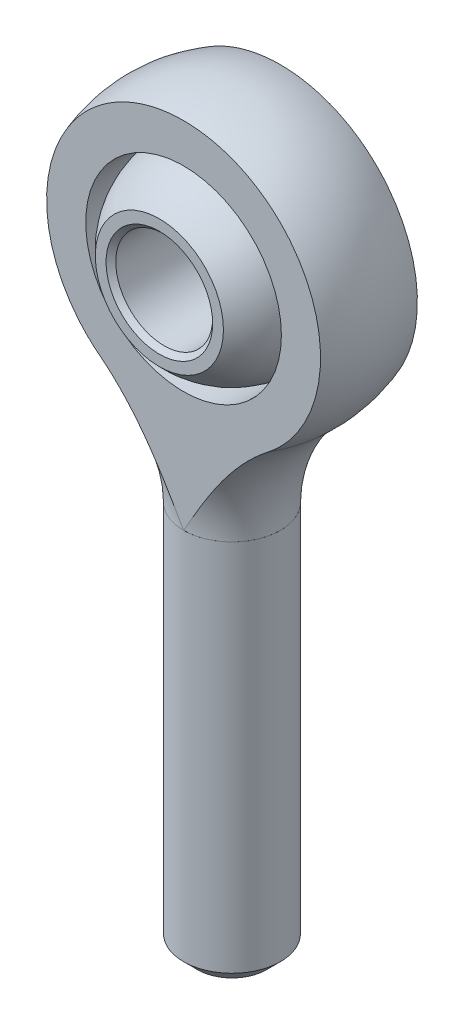
ISO-10303-21;
HEADER;
FILE_DESCRIPTION(('STEP AP214'),'2;1');
FILE_NAME('part.step','',(''),(''),'','','');
FILE_SCHEMA(('AUTOMOTIVE_DESIGN { 1 0 10303 214 1 1 1 1 }'));
ENDSEC;
DATA;
#1=APPLICATION_CONTEXT('core data for automotive mechanical design processes');
#2=APPLICATION_PROTOCOL_DEFINITION('international standard','automotive_design',2000,#1);
#3=PRODUCT_CONTEXT('',#1,'mechanical');
#4=PRODUCT('Part','Part','',(#3));
#5=PRODUCT_RELATED_PRODUCT_CATEGORY('part','',(#4));
#6=PRODUCT_DEFINITION_FORMATION('','',#4);
#7=PRODUCT_DEFINITION_CONTEXT('part definition',#1,'design');
#8=PRODUCT_DEFINITION('design','',#6,#7);
#9=PRODUCT_DEFINITION_SHAPE('','',#8);
#10=(LENGTH_UNIT() NAMED_UNIT(*) SI_UNIT(.MILLI.,.METRE.));
#11=(NAMED_UNIT(*) PLANE_ANGLE_UNIT() SI_UNIT($,.RADIAN.));
#12=(NAMED_UNIT(*) SI_UNIT($,.STERADIAN.) SOLID_ANGLE_UNIT());
#13=UNCERTAINTY_MEASURE_WITH_UNIT(LENGTH_MEASURE(1.E-05),#10,'distance_accuracy_value','');
#14=(GEOMETRIC_REPRESENTATION_CONTEXT(3) GLOBAL_UNCERTAINTY_ASSIGNED_CONTEXT((#13)) GLOBAL_UNIT_ASSIGNED_CONTEXT((#10,
#11,#12)) REPRESENTATION_CONTEXT('',''));
#15=CARTESIAN_POINT('',(0.,0.,0.));
#16=DIRECTION('',(0.,0.,1.));
#17=DIRECTION('',(1.,0.,0.));
#18=AXIS2_PLACEMENT_3D('',#15,#16,#17);
#19=CARTESIAN_POINT('',(0.,14.2875,0.));
#20=DIRECTION('',(0.,-1.,0.));
#21=DIRECTION('',(-1.,0.,0.));
#22=AXIS2_PLACEMENT_3D('',#19,#20,#21);
#23=SPHERICAL_SURFACE('',#22,6.35);
#24=CARTESIAN_POINT('',(0.,14.2875,0.));
#25=DIRECTION('',(0.,0.,1.));
#26=DIRECTION('',(1.,0.,0.));
#27=AXIS2_PLACEMENT_3D('',#24,#25,#26);
#28=SPHERICAL_SURFACE('',#27,6.35);
#29=CARTESIAN_POINT('',(0.,14.2875,-4.7625));
#30=DIRECTION('',(0.,0.,1.));
#31=DIRECTION('',(1.,0.,0.));
#32=AXIS2_PLACEMENT_3D('',#29,#30,#31);
#33=CIRCLE('',#32,4.20013020631503);
#34=CARTESIAN_POINT('',(4.20013020631503,14.2875,-4.7625));
#35=VERTEX_POINT('',#34);
#36=EDGE_CURVE('E72',#35,#35,#33,.F.);
#37=ORIENTED_EDGE('',*,*,#36,.F.);
#38=EDGE_LOOP('',(#37));
#39=FACE_BOUND('',#38,.T.);
#40=CARTESIAN_POINT('',(0.,14.2875,4.7625));
#41=DIRECTION('',(0.,0.,1.));
#42=DIRECTION('',(1.,0.,0.));
#43=AXIS2_PLACEMENT_3D('',#40,#41,#42);
#44=CIRCLE('',#43,4.20013020631504);
#45=CARTESIAN_POINT('',(4.20013020631504,14.2875,4.7625));
#46=VERTEX_POINT('',#45);
#47=EDGE_CURVE('E75',#46,#46,#44,.F.);
#48=ORIENTED_EDGE('',*,*,#47,.T.);
#49=EDGE_LOOP('',(#48));
#50=FACE_BOUND('',#49,.T.);
#51=ADVANCED_FACE('F52',(#39,#50),#28,.T.);
#52=CARTESIAN_POINT('',(0.,14.2875,-6.35));
#53=DIRECTION('',(0.,0.,1.));
#54=DIRECTION('',(1.,0.,0.));
#55=AXIS2_PLACEMENT_3D('',#52,#53,#54);
#56=CYLINDRICAL_SURFACE('',#55,3.175);
#57=CARTESIAN_POINT('',(0.,14.2875,-4.445));
#58=DIRECTION('',(0.,0.,1.));
#59=DIRECTION('',(1.,0.,0.));
#60=AXIS2_PLACEMENT_3D('',#57,#58,#59);
#61=CIRCLE('',#60,3.175);
#62=CARTESIAN_POINT('',(3.175,14.2875,-4.445));
#63=VERTEX_POINT('',#62);
#64=EDGE_CURVE('E63',#63,#63,#61,.F.);
#65=ORIENTED_EDGE('',*,*,#64,.T.);
#66=EDGE_LOOP('',(#65));
#67=FACE_BOUND('',#66,.T.);
#68=CARTESIAN_POINT('',(0.,14.2875,4.445));
#69=DIRECTION('',(0.,0.,1.));
#70=DIRECTION('',(1.,0.,0.));
#71=AXIS2_PLACEMENT_3D('',#68,#69,#70);
#72=CIRCLE('',#71,3.175);
#73=CARTESIAN_POINT('',(3.175,14.2875,4.445));
#74=VERTEX_POINT('',#73);
#75=EDGE_CURVE('E67',#74,#74,#72,.T.);
#76=ORIENTED_EDGE('',*,*,#75,.T.);
#77=EDGE_LOOP('',(#76));
#78=FACE_BOUND('',#77,.T.);
#79=ADVANCED_FACE('F90',(#67,#78),#56,.F.);
#80=CARTESIAN_POINT('',(0.,0.,-4.7625));
#81=DIRECTION('',(0.,0.,1.));
#82=DIRECTION('',(1.,0.,0.));
#83=AXIS2_PLACEMENT_3D('',#80,#81,#82);
#84=PLANE('',#83);
#85=CARTESIAN_POINT('',(0.,14.2875,-4.7625));
#86=DIRECTION('',(0.,0.,1.));
#87=DIRECTION('',(1.,0.,0.));
#88=AXIS2_PLACEMENT_3D('',#85,#86,#87);
#89=CIRCLE('',#88,3.4925);
#90=CARTESIAN_POINT('',(3.49250000000001,14.2875,-4.7625));
#91=VERTEX_POINT('',#90);
#92=EDGE_CURVE('E59',#91,#91,#89,.T.);
#93=ORIENTED_EDGE('',*,*,#92,.T.);
#94=EDGE_LOOP('',(#93));
#95=FACE_BOUND('',#94,.T.);
#96=ORIENTED_EDGE('',*,*,#36,.T.);
#97=EDGE_LOOP('',(#96));
#98=FACE_BOUND('',#97,.T.);
#99=ADVANCED_FACE('F83',(#95,#98),#84,.F.);
#100=CARTESIAN_POINT('',(0.,0.,4.7625));
#101=DIRECTION('',(0.,0.,1.));
#102=DIRECTION('',(1.,0.,0.));
#103=AXIS2_PLACEMENT_3D('',#100,#101,#102);
#104=PLANE('',#103);
#105=CARTESIAN_POINT('',(0.,14.2875,4.7625));
#106=DIRECTION('',(0.,0.,1.));
#107=DIRECTION('',(1.,0.,0.));
#108=AXIS2_PLACEMENT_3D('',#105,#106,#107);
#109=CIRCLE('',#108,3.4925);
#110=CARTESIAN_POINT('',(3.4925,14.2875,4.7625));
#111=VERTEX_POINT('',#110);
#112=EDGE_CURVE('E11',#111,#111,#109,.F.);
#113=ORIENTED_EDGE('',*,*,#112,.T.);
#114=EDGE_LOOP('',(#113));
#115=FACE_BOUND('',#114,.T.);
#116=ORIENTED_EDGE('',*,*,#47,.F.);
#117=EDGE_LOOP('',(#116));
#118=FACE_BOUND('',#117,.T.);
#119=ADVANCED_FACE('F80',(#115,#118),#104,.T.);
#120=CARTESIAN_POINT('',(0.,14.2875,-4.445));
#121=DIRECTION('',(0.,0.,-1.));
#122=DIRECTION('',(-1.,0.,0.));
#123=AXIS2_PLACEMENT_3D('',#120,#121,#122);
#124=CONICAL_SURFACE('',#123,3.175,0.785398163397453);
#125=ORIENTED_EDGE('',*,*,#92,.F.);
#126=EDGE_LOOP('',(#125));
#127=FACE_BOUND('',#126,.T.);
#128=ORIENTED_EDGE('',*,*,#64,.F.);
#129=EDGE_LOOP('',(#128));
#130=FACE_BOUND('',#129,.T.);
#131=ADVANCED_FACE('F82',(#127,#130),#124,.F.);
#132=CARTESIAN_POINT('',(0.,14.2875,4.7625));
#133=DIRECTION('',(0.,0.,1.));
#134=DIRECTION('',(1.,0.,0.));
#135=AXIS2_PLACEMENT_3D('',#132,#133,#134);
#136=CONICAL_SURFACE('',#135,3.4925,0.785398163397446);
#137=ORIENTED_EDGE('',*,*,#75,.F.);
#138=EDGE_LOOP('',(#137));
#139=FACE_BOUND('',#138,.T.);
#140=ORIENTED_EDGE('',*,*,#112,.F.);
#141=EDGE_LOOP('',(#140));
#142=FACE_BOUND('',#141,.T.);
#143=ADVANCED_FACE('F54',(#139,#142),#136,.F.);
#144=CLOSED_SHELL('',(#51,#79,#99,#119,#131,#143));
#145=MANIFOLD_SOLID_BREP('B2',#144);
#146=CARTESIAN_POINT('',(0.,0.,0.));
#147=DIRECTION('',(0.,1.,0.));
#148=DIRECTION('',(-1.,0.,0.));
#149=AXIS2_PLACEMENT_3D('',#146,#147,#148);
#150=TOROIDAL_SURFACE('',#149,12.8984375,9.72343749999999);
#151=CARTESIAN_POINT('',(0.,0.,0.));
#152=DIRECTION('',(0.,1.,0.));
#153=DIRECTION('',(-1.,0.,0.));
#154=AXIS2_PLACEMENT_3D('',#151,#152,#153);
#155=CIRCLE('',#154,3.175);
#156=CARTESIAN_POINT('',(0.,0.,3.175));
#157=VERTEX_POINT('',#156);
#158=CARTESIAN_POINT('',(0.,0.,-3.175));
#159=VERTEX_POINT('',#158);
#160=EDGE_CURVE('E195',#157,#159,#155,.T.);
#161=ORIENTED_EDGE('',*,*,#160,.T.);
#162=CARTESIAN_POINT('',(0.,0.,-3.17500000000001));
#163=CARTESIAN_POINT('',(0.00326153280940056,0.00570768458317873,-3.17500000000001));
#164=CARTESIAN_POINT('',(0.00652306727261801,0.0114153698479134,-3.17500000000002));
#165=CARTESIAN_POINT('',(0.273129494115397,0.477974240381225,-3.17500000000035));
#166=CARTESIAN_POINT('',(0.536560192569003,0.938786382511719,-3.17500000000011));
#167=CARTESIAN_POINT('',(1.075662654448,1.853227853926,-3.17499999999993));
#168=CARTESIAN_POINT('',(1.3513322312136,2.30685844681078,-3.17499999999999));
#169=CARTESIAN_POINT('',(1.92559609433375,3.19894900715909,-3.17500000000004));
#170=CARTESIAN_POINT('',(2.22416629490616,3.63742422867979,-3.17500000000002));
#171=CARTESIAN_POINT('',(2.8530989562683,4.49102276264757,-3.17500000000001));
#172=CARTESIAN_POINT('',(3.18344395160262,4.90615870724843,-3.17500000000001));
#173=CARTESIAN_POINT('',(3.77466960906392,5.58162755340587,-3.17500000000001));
#174=CARTESIAN_POINT('',(4.02585009152447,5.85044049904912,-3.17500000000001));
#175=CARTESIAN_POINT('',(4.54711374408077,6.36901465417316,-3.17500000000001));
#176=CARTESIAN_POINT('',(4.81719088353926,6.61878188916022,-3.17500000000001));
#177=CARTESIAN_POINT('',(5.37662445732568,7.09612768080745,-3.17500000000001));
#178=CARTESIAN_POINT('',(5.6659914754178,7.32369388494061,-3.17500000000001));
#179=CARTESIAN_POINT('',(6.26322715756046,7.75319037760835,-3.17500000000001));
#180=CARTESIAN_POINT('',(6.57109562035419,7.9551209449304,-3.17500000000001));
#181=CARTESIAN_POINT('',(7.20718830531996,8.33213779574809,-3.17500000000001));
#182=CARTESIAN_POINT('',(7.53558873718559,8.50692791162835,-3.17500000000001));
#183=CARTESIAN_POINT('',(8.20771747669195,8.8241919305884,-3.17500000000001));
#184=CARTESIAN_POINT('',(8.55144656909241,8.96666417685807,-3.17500000000001));
#185=CARTESIAN_POINT('',(9.25110720223131,9.21656726401361,-3.17500000000001));
#186=CARTESIAN_POINT('',(9.60702765351498,9.3240290621725,-3.17500000000001));
#187=CARTESIAN_POINT('',(10.3280020281684,9.50191139488449,-3.17500000000001));
#188=CARTESIAN_POINT('',(10.6930544047761,9.57233815850804,-3.17500000000001));
#189=CARTESIAN_POINT('',(11.3741481177677,9.66696888095735,-3.17500000000001));
#190=CARTESIAN_POINT('',(11.6894621095488,9.69646466998759,-3.17500000000001));
#191=CARTESIAN_POINT('',(12.3214131945657,9.72667494727211,-3.17500000000001));
#192=CARTESIAN_POINT('',(12.6380499892607,9.72739561225393,-3.17500000000001));
#193=CARTESIAN_POINT('',(13.2714560117358,9.69958458823502,-3.17500000000001));
#194=CARTESIAN_POINT('',(13.5882199938743,9.67092754785076,-3.17500000000001));
#195=CARTESIAN_POINT('',(14.060301630899,9.60580647493072,-3.17500000000001));
#196=CARTESIAN_POINT('',(14.2172131664817,9.58039570302806,-3.17500000000001));
#197=CARTESIAN_POINT('',(14.5296709917857,9.52221005311295,-3.17500000000001));
#198=CARTESIAN_POINT('',(14.6852172274529,9.48943488488747,-3.17500000000001));
#199=CARTESIAN_POINT('',(14.8399244089083,9.45298870973282,-3.17500000000001));
#200=B_SPLINE_CURVE_WITH_KNOTS('',3,(#162,#163,#164,#165,#166,#167,#168,#169,#170,#171,#172,
#173,#174,#175,#176,#177,#178,#179,#180,#181,#182,#183,#184,#185,#186,#187,#188,#189,#190,#191,
#192,#193,#194,#195,#196,#197,#198,#199),.UNSPECIFIED.,.F.,.F.,(4,2,2,2,2,2,2,2,2,2,2,2,2,2,2,2,
2,2,4),(0.,0.0197214984217776,1.61208077496982,3.20415668854832,4.79458050738229,
6.3841350697976,7.48699761772031,8.58950979194405,9.69263194038169,10.795742091342,
11.9101519426778,13.0246189125206,14.1380977461436,15.2513892393634,16.2001992986571,
17.1488056899235,18.1014765941876,18.5781908797629,19.0549239547892),.UNSPECIFIED.);
#201=CARTESIAN_POINT('',(5.53702467554139,7.21739690722648,-3.17500000000001));
#202=VERTEX_POINT('',#201);
#203=EDGE_CURVE('E50',#159,#202,#200,.T.);
#204=ORIENTED_EDGE('',*,*,#203,.T.);
#205=CARTESIAN_POINT('',(0.,7.21739690721649,0.));
#206=DIRECTION('',(0.,1.,0.));
#207=DIRECTION('',(-1.,0.,0.));
#208=AXIS2_PLACEMENT_3D('',#205,#206,#207);
#209=CIRCLE('',#208,6.38273195876288);
#210=CARTESIAN_POINT('',(5.53702467554139,7.21739690722648,3.17500000000001));
#211=VERTEX_POINT('',#210);
#212=EDGE_CURVE('E201',#211,#202,#209,.T.);
#213=ORIENTED_EDGE('',*,*,#212,.F.);
#214=CARTESIAN_POINT('',(0.,0.,3.175));
#215=CARTESIAN_POINT('',(0.00326153280968916,0.00570768458301649,3.17500000000001));
#216=CARTESIAN_POINT('',(0.00652306727318909,0.0114153698475898,3.17500000000001));
#217=CARTESIAN_POINT('',(0.273129494139749,0.477974240370057,3.17500000000025));
#218=CARTESIAN_POINT('',(0.536560192577593,0.938786382512307,3.17500000000008));
#219=CARTESIAN_POINT('',(1.07566265444661,1.85322785393754,3.17499999999995));
#220=CARTESIAN_POINT('',(1.35133223121798,2.30685844682153,3.17499999999999));
#221=CARTESIAN_POINT('',(1.92559609434366,3.19894900717051,3.17500000000003));
#222=CARTESIAN_POINT('',(2.22416629491579,3.63742422869272,3.17500000000001));
#223=CARTESIAN_POINT('',(2.85309895627944,4.49102276266281,3.17500000000001));
#224=CARTESIAN_POINT('',(3.18344395161558,4.90615870726445,3.17500000000001));
#225=CARTESIAN_POINT('',(3.77466960907839,5.58162755342156,3.17500000000001));
#226=CARTESIAN_POINT('',(4.02585009153859,5.85044049906379,3.17500000000001));
#227=CARTESIAN_POINT('',(4.54711374409417,6.36901465418585,3.17500000000001));
#228=CARTESIAN_POINT('',(4.8171908835523,6.61878188917193,3.17500000000001));
#229=CARTESIAN_POINT('',(5.37662445733852,7.09612768081782,3.17500000000001));
#230=CARTESIAN_POINT('',(5.66599147543084,7.32369388495056,3.17500000000001));
#231=CARTESIAN_POINT('',(6.26322715757394,7.75319037761747,3.17500000000001));
#232=CARTESIAN_POINT('',(6.57109562036791,7.9551209449391,3.17500000000001));
#233=CARTESIAN_POINT('',(7.20718830533395,8.33213779575581,3.17500000000001));
#234=CARTESIAN_POINT('',(7.5355887371996,8.50692791163551,3.17500000000001));
#235=CARTESIAN_POINT('',(8.20771747670592,8.82419193059444,3.17500000000001));
#236=CARTESIAN_POINT('',(8.55144656910631,8.96666417686355,3.17500000000001));
#237=CARTESIAN_POINT('',(9.25110720224452,9.21656726401781,3.17500000000001));
#238=CARTESIAN_POINT('',(9.60702765352753,9.32402906217603,3.17500000000001));
#239=CARTESIAN_POINT('',(10.3280020281796,9.50191139488682,3.17500000000001));
#240=CARTESIAN_POINT('',(10.6930544047865,9.57233815850984,3.17500000000001));
#241=CARTESIAN_POINT('',(11.3741481177771,9.66696888095835,3.17500000000001));
#242=CARTESIAN_POINT('',(11.6894621095577,9.69646466998828,3.17500000000001));
#243=CARTESIAN_POINT('',(12.3214131945738,9.72667494727223,3.17500000000001));
#244=CARTESIAN_POINT('',(12.6380499892684,9.72739561225382,3.17500000000001));
#245=CARTESIAN_POINT('',(13.2714560117432,9.69958458823448,3.17500000000001));
#246=CARTESIAN_POINT('',(13.5882199938819,9.67092754784996,3.17500000000001));
#247=CARTESIAN_POINT('',(14.0603016309067,9.60580647492954,3.17500000000001));
#248=CARTESIAN_POINT('',(14.2172131664894,9.58039570302674,3.17500000000001));
#249=CARTESIAN_POINT('',(14.5296709917936,9.52221005311135,3.17500000000001));
#250=CARTESIAN_POINT('',(14.6852172274608,9.48943488488574,3.17500000000001));
#251=CARTESIAN_POINT('',(14.8399244089163,9.45298870973094,3.17500000000001));
#252=B_SPLINE_CURVE_WITH_KNOTS('',3,(#214,#215,#216,#217,#218,#219,#220,#221,#222,#223,#224,
#225,#226,#227,#228,#229,#230,#231,#232,#233,#234,#235,#236,#237,#238,#239,#240,#241,#242,#243,
#244,#245,#246,#247,#248,#249,#250,#251),.UNSPECIFIED.,.F.,.F.,(4,2,2,2,2,2,2,2,2,2,2,2,2,2,2,2,
2,2,4),(0.,0.0197214984217776,1.61208077497697,3.20415668856199,4.79458050739954,
6.38413506981987,7.48699761773967,8.58950979196063,9.69263194039796,10.7957420913582,
11.9101519426933,13.0246189125353,14.1380977461558,15.2513892393732,16.2001992986656,
17.1488056899307,18.1014765941953,18.5781908797708,19.0549239547973),.UNSPECIFIED.);
#253=EDGE_CURVE('E187',#211,#157,#252,.F.);
#254=ORIENTED_EDGE('',*,*,#253,.T.);
#255=EDGE_LOOP('',(#161,#204,#213,#254));
#256=FACE_BOUND('',#255,.T.);
#257=ADVANCED_FACE('F151',(#256),#150,.F.);
#258=CARTESIAN_POINT('',(0.,14.2875,0.));
#259=DIRECTION('',(0.,1.,0.));
#260=DIRECTION('',(1.,0.,0.));
#261=AXIS2_PLACEMENT_3D('',#258,#259,#260);
#262=SPHERICAL_SURFACE('',#261,9.525);
#263=ORIENTED_EDGE('',*,*,#212,.T.);
#264=CARTESIAN_POINT('',(0.,14.2875,-3.175));
#265=DIRECTION('',(0.,0.,1.));
#266=DIRECTION('',(0.,-1.,0.));
#267=AXIS2_PLACEMENT_3D('',#264,#265,#266);
#268=CIRCLE('',#267,8.98025612106915);
#269=CARTESIAN_POINT('',(-5.53702467554139,7.21739690722647,-3.17500000000001));
#270=VERTEX_POINT('',#269);
#271=EDGE_CURVE('E204',#202,#270,#268,.T.);
#272=ORIENTED_EDGE('',*,*,#271,.T.);
#273=CARTESIAN_POINT('',(-5.53702467554139,7.21739690722648,3.17500000000001));
#274=VERTEX_POINT('',#273);
#275=EDGE_CURVE('E203',#270,#274,#209,.T.);
#276=ORIENTED_EDGE('',*,*,#275,.T.);
#277=CARTESIAN_POINT('',(0.,14.2875,3.175));
#278=DIRECTION('',(0.,0.,-1.));
#279=DIRECTION('',(0.,1.,0.));
#280=AXIS2_PLACEMENT_3D('',#277,#278,#279);
#281=CIRCLE('',#280,8.98025612106915);
#282=EDGE_CURVE('E190',#274,#211,#281,.T.);
#283=ORIENTED_EDGE('',*,*,#282,.T.);
#284=EDGE_LOOP('',(#263,#272,#276,#283));
#285=FACE_BOUND('',#284,.T.);
#286=ADVANCED_FACE('F153',(#285),#262,.T.);
#287=CARTESIAN_POINT('',(3.175,0.,0.));
#288=DIRECTION('',(0.,1.,0.));
#289=DIRECTION('',(-1.,0.,0.));
#290=AXIS2_PLACEMENT_3D('',#287,#288,#289);
#291=PLANE('',#290);
#292=ORIENTED_EDGE('',*,*,#160,.F.);
#293=EDGE_CURVE('E207',#159,#157,#155,.T.);
#294=ORIENTED_EDGE('',*,*,#293,.F.);
#295=EDGE_LOOP('',(#292,#294));
#296=FACE_BOUND('',#295,.T.);
#297=ADVANCED_FACE('F225',(#296),#291,.F.);
#298=ORIENTED_EDGE('',*,*,#275,.F.);
#299=CARTESIAN_POINT('',(0.,0.,-3.17500000000001));
#300=CARTESIAN_POINT('',(-0.00326153280940057,0.00570768458317873,-3.17500000000001));
#301=CARTESIAN_POINT('',(-0.00652306727261801,0.0114153698479134,-3.17500000000002));
#302=CARTESIAN_POINT('',(-0.273129494115397,0.477974240381225,-3.17500000000035));
#303=CARTESIAN_POINT('',(-0.536560192569003,0.938786382511719,-3.17500000000011));
#304=CARTESIAN_POINT('',(-1.075662654448,1.853227853926,-3.17499999999993));
#305=CARTESIAN_POINT('',(-1.3513322312136,2.30685844681079,-3.17499999999999));
#306=CARTESIAN_POINT('',(-1.92559609433375,3.19894900715908,-3.17500000000004));
#307=CARTESIAN_POINT('',(-2.22416629490617,3.63742422867979,-3.17500000000002));
#308=CARTESIAN_POINT('',(-2.8530989562683,4.49102276264757,-3.17500000000001));
#309=CARTESIAN_POINT('',(-3.18344395160262,4.90615870724843,-3.17500000000001));
#310=CARTESIAN_POINT('',(-3.77466960906392,5.58162755340587,-3.17500000000001));
#311=CARTESIAN_POINT('',(-4.02585009152447,5.85044049904911,-3.17500000000001));
#312=CARTESIAN_POINT('',(-4.54711374408077,6.36901465417315,-3.17500000000001));
#313=CARTESIAN_POINT('',(-4.81719088353926,6.61878188916021,-3.17500000000001));
#314=CARTESIAN_POINT('',(-5.37662445732568,7.09612768080745,-3.17500000000001));
#315=CARTESIAN_POINT('',(-5.6659914754178,7.32369388494061,-3.17500000000001));
#316=CARTESIAN_POINT('',(-6.26322715756046,7.75319037760835,-3.17500000000001));
#317=CARTESIAN_POINT('',(-6.57109562035419,7.95512094493039,-3.17500000000001));
#318=CARTESIAN_POINT('',(-7.20718830531996,8.33213779574809,-3.17500000000001));
#319=CARTESIAN_POINT('',(-7.53558873718559,8.50692791162834,-3.17500000000001));
#320=CARTESIAN_POINT('',(-8.20771747669196,8.8241919305884,-3.17500000000001));
#321=CARTESIAN_POINT('',(-8.55144656909241,8.96666417685806,-3.17500000000001));
#322=CARTESIAN_POINT('',(-9.25110720223131,9.21656726401361,-3.17500000000001));
#323=CARTESIAN_POINT('',(-9.60702765351498,9.3240290621725,-3.17500000000001));
#324=CARTESIAN_POINT('',(-10.3280020281684,9.50191139488449,-3.17500000000001));
#325=CARTESIAN_POINT('',(-10.6930544047761,9.57233815850804,-3.17500000000001));
#326=CARTESIAN_POINT('',(-11.3741481177677,9.66696888095735,-3.17500000000001));
#327=CARTESIAN_POINT('',(-11.6894621095487,9.69646466998758,-3.17500000000001));
#328=CARTESIAN_POINT('',(-12.3214131945657,9.7266749472721,-3.17500000000001));
#329=CARTESIAN_POINT('',(-12.6380499892607,9.72739561225393,-3.17500000000001));
#330=CARTESIAN_POINT('',(-13.2714560117358,9.69958458823502,-3.17500000000001));
#331=CARTESIAN_POINT('',(-13.5882199938743,9.67092754785076,-3.17500000000001));
#332=CARTESIAN_POINT('',(-14.060301630899,9.60580647493072,-3.17500000000001));
#333=CARTESIAN_POINT('',(-14.2172131664816,9.58039570302806,-3.17500000000001));
#334=CARTESIAN_POINT('',(-14.5296709917857,9.52221005311295,-3.17500000000001));
#335=CARTESIAN_POINT('',(-14.6852172274529,9.48943488488747,-3.17500000000001));
#336=CARTESIAN_POINT('',(-14.8399244089083,9.45298870973282,-3.17500000000001));
#337=B_SPLINE_CURVE_WITH_KNOTS('',3,(#299,#300,#301,#302,#303,#304,#305,#306,#307,#308,#309,
#310,#311,#312,#313,#314,#315,#316,#317,#318,#319,#320,#321,#322,#323,#324,#325,#326,#327,#328,
#329,#330,#331,#332,#333,#334,#335,#336),.UNSPECIFIED.,.F.,.F.,(4,2,2,2,2,2,2,2,2,2,2,2,2,2,2,2,
2,2,4),(0.,0.0197214984217776,1.61208077496982,3.20415668854832,4.79458050738229,
6.3841350697976,7.48699761772031,8.58950979194404,9.69263194038169,10.795742091342,
11.9101519426778,13.0246189125206,14.1380977461436,15.2513892393634,16.2001992986571,
17.1488056899235,18.1014765941876,18.5781908797629,19.0549239547892),.UNSPECIFIED.);
#338=EDGE_CURVE('E165',#270,#159,#337,.F.);
#339=ORIENTED_EDGE('',*,*,#338,.T.);
#340=ORIENTED_EDGE('',*,*,#293,.T.);
#341=CARTESIAN_POINT('',(0.,0.,3.175));
#342=CARTESIAN_POINT('',(-0.00326153280968916,0.00570768458301648,3.17500000000001));
#343=CARTESIAN_POINT('',(-0.00652306727318909,0.0114153698475898,3.17500000000001));
#344=CARTESIAN_POINT('',(-0.273129494139749,0.477974240370057,3.17500000000025));
#345=CARTESIAN_POINT('',(-0.536560192577592,0.938786382512307,3.17500000000008));
#346=CARTESIAN_POINT('',(-1.0756626544466,1.85322785393754,3.17499999999995));
#347=CARTESIAN_POINT('',(-1.35133223121798,2.30685844682153,3.17499999999999));
#348=CARTESIAN_POINT('',(-1.92559609434366,3.19894900717051,3.17500000000003));
#349=CARTESIAN_POINT('',(-2.22416629491579,3.63742422869272,3.17500000000001));
#350=CARTESIAN_POINT('',(-2.85309895627944,4.4910227626628,3.17500000000001));
#351=CARTESIAN_POINT('',(-3.18344395161558,4.90615870726445,3.17500000000001));
#352=CARTESIAN_POINT('',(-3.77466960907839,5.58162755342156,3.17500000000001));
#353=CARTESIAN_POINT('',(-4.02585009153859,5.85044049906379,3.17500000000001));
#354=CARTESIAN_POINT('',(-4.54711374409417,6.36901465418584,3.17500000000001));
#355=CARTESIAN_POINT('',(-4.8171908835523,6.61878188917193,3.17500000000001));
#356=CARTESIAN_POINT('',(-5.37662445733852,7.09612768081782,3.17500000000001));
#357=CARTESIAN_POINT('',(-5.66599147543084,7.32369388495055,3.17500000000001));
#358=CARTESIAN_POINT('',(-6.26322715757394,7.75319037761747,3.17500000000001));
#359=CARTESIAN_POINT('',(-6.57109562036791,7.95512094493909,3.17500000000001));
#360=CARTESIAN_POINT('',(-7.20718830533395,8.33213779575581,3.17500000000001));
#361=CARTESIAN_POINT('',(-7.5355887371996,8.5069279116355,3.17500000000001));
#362=CARTESIAN_POINT('',(-8.20771747670592,8.82419193059444,3.17500000000001));
#363=CARTESIAN_POINT('',(-8.55144656910631,8.96666417686355,3.17500000000001));
#364=CARTESIAN_POINT('',(-9.25110720224452,9.2165672640178,3.17500000000001));
#365=CARTESIAN_POINT('',(-9.60702765352753,9.32402906217603,3.17500000000001));
#366=CARTESIAN_POINT('',(-10.3280020281796,9.50191139488681,3.17500000000001));
#367=CARTESIAN_POINT('',(-10.6930544047865,9.57233815850983,3.17500000000001));
#368=CARTESIAN_POINT('',(-11.3741481177771,9.66696888095834,3.17500000000001));
#369=CARTESIAN_POINT('',(-11.6894621095577,9.69646466998827,3.17500000000001));
#370=CARTESIAN_POINT('',(-12.3214131945738,9.72667494727223,3.17500000000001));
#371=CARTESIAN_POINT('',(-12.6380499892684,9.72739561225382,3.17500000000001));
#372=CARTESIAN_POINT('',(-13.2714560117432,9.69958458823447,3.17500000000001));
#373=CARTESIAN_POINT('',(-13.5882199938819,9.67092754784996,3.17500000000001));
#374=CARTESIAN_POINT('',(-14.0603016309067,9.60580647492953,3.17500000000001));
#375=CARTESIAN_POINT('',(-14.2172131664894,9.58039570302674,3.17500000000001));
#376=CARTESIAN_POINT('',(-14.5296709917936,9.52221005311135,3.17500000000001));
#377=CARTESIAN_POINT('',(-14.6852172274608,9.48943488488574,3.17500000000001));
#378=CARTESIAN_POINT('',(-14.8399244089163,9.45298870973094,3.17500000000001));
#379=B_SPLINE_CURVE_WITH_KNOTS('',3,(#341,#342,#343,#344,#345,#346,#347,#348,#349,#350,#351,
#352,#353,#354,#355,#356,#357,#358,#359,#360,#361,#362,#363,#364,#365,#366,#367,#368,#369,#370,
#371,#372,#373,#374,#375,#376,#377,#378),.UNSPECIFIED.,.F.,.F.,(4,2,2,2,2,2,2,2,2,2,2,2,2,2,2,2,
2,2,4),(0.,0.0197214984217776,1.61208077497697,3.20415668856199,4.79458050739953,
6.38413506981987,7.48699761773967,8.58950979196062,9.69263194039796,10.7957420913582,
11.9101519426932,13.0246189125353,14.1380977461558,15.2513892393732,16.2001992986656,
17.1488056899307,18.1014765941953,18.5781908797708,19.0549239547973),.UNSPECIFIED.);
#380=EDGE_CURVE('E178',#157,#274,#379,.T.);
#381=ORIENTED_EDGE('',*,*,#380,.T.);
#382=EDGE_LOOP('',(#298,#339,#340,#381));
#383=FACE_BOUND('',#382,.T.);
#384=ADVANCED_FACE('F222',(#383),#150,.F.);
#385=CARTESIAN_POINT('',(-9.525,14.2875,3.175));
#386=DIRECTION('',(0.,0.,-1.));
#387=DIRECTION('',(0.,1.,0.));
#388=AXIS2_PLACEMENT_3D('',#385,#386,#387);
#389=PLANE('',#388);
#390=CARTESIAN_POINT('',(0.,14.2875,3.175));
#391=DIRECTION('',(0.,0.,1.));
#392=DIRECTION('',(1.,0.,0.));
#393=AXIS2_PLACEMENT_3D('',#390,#391,#392);
#394=CIRCLE('',#393,6.4135);
#395=CARTESIAN_POINT('',(6.4135,14.2875,3.175));
#396=VERTEX_POINT('',#395);
#397=EDGE_CURVE('E309',#396,#396,#394,.T.);
#398=ORIENTED_EDGE('',*,*,#397,.F.);
#399=EDGE_LOOP('',(#398));
#400=FACE_BOUND('',#399,.T.);
#401=ORIENTED_EDGE('',*,*,#380,.F.);
#402=ORIENTED_EDGE('',*,*,#253,.F.);
#403=ORIENTED_EDGE('',*,*,#282,.F.);
#404=EDGE_LOOP('',(#401,#402,#403));
#405=FACE_BOUND('',#404,.T.);
#406=ADVANCED_FACE('F189',(#400,#405),#389,.F.);
#407=CARTESIAN_POINT('',(-9.525,14.2875,-3.175));
#408=DIRECTION('',(0.,0.,1.));
#409=DIRECTION('',(0.,-1.,0.));
#410=AXIS2_PLACEMENT_3D('',#407,#408,#409);
#411=PLANE('',#410);
#412=CARTESIAN_POINT('',(0.,14.2875,-3.175));
#413=DIRECTION('',(0.,0.,1.));
#414=DIRECTION('',(1.,0.,0.));
#415=AXIS2_PLACEMENT_3D('',#412,#413,#414);
#416=CIRCLE('',#415,6.4135);
#417=CARTESIAN_POINT('',(6.4135,14.2875,-3.175));
#418=VERTEX_POINT('',#417);
#419=EDGE_CURVE('E205',#418,#418,#416,.T.);
#420=ORIENTED_EDGE('',*,*,#419,.T.);
#421=EDGE_LOOP('',(#420));
#422=FACE_BOUND('',#421,.T.);
#423=ORIENTED_EDGE('',*,*,#203,.F.);
#424=ORIENTED_EDGE('',*,*,#338,.F.);
#425=ORIENTED_EDGE('',*,*,#271,.F.);
#426=EDGE_LOOP('',(#423,#424,#425));
#427=FACE_BOUND('',#426,.T.);
#428=ADVANCED_FACE('F234',(#422,#427),#411,.F.);
#429=CARTESIAN_POINT('',(0.,14.2875,-3.175));
#430=DIRECTION('',(0.,0.,1.));
#431=DIRECTION('',(1.,0.,0.));
#432=AXIS2_PLACEMENT_3D('',#429,#430,#431);
#433=CYLINDRICAL_SURFACE('',#432,6.4135);
#434=ORIENTED_EDGE('',*,*,#419,.F.);
#435=EDGE_LOOP('',(#434));
#436=FACE_BOUND('',#435,.T.);
#437=ORIENTED_EDGE('',*,*,#397,.T.);
#438=EDGE_LOOP('',(#437));
#439=FACE_BOUND('',#438,.T.);
#440=ADVANCED_FACE('F238',(#436,#439),#433,.F.);
#441=CLOSED_SHELL('',(#257,#286,#297,#384,#406,#428,#440));
#442=MANIFOLD_SOLID_BREP('B6',#441);
#443=CARTESIAN_POINT('',(3.175,0.,0.));
#444=DIRECTION('',(0.,-1.,0.));
#445=DIRECTION('',(1.,0.,0.));
#446=AXIS2_PLACEMENT_3D('',#443,#444,#445);
#447=PLANE('',#446);
#448=CARTESIAN_POINT('',(0.,0.,0.));
#449=DIRECTION('',(0.,1.,0.));
#450=DIRECTION('',(-1.,0.,0.));
#451=AXIS2_PLACEMENT_3D('',#448,#449,#450);
#452=CIRCLE('',#451,3.175);
#453=CARTESIAN_POINT('',(-3.175,0.,0.));
#454=VERTEX_POINT('',#453);
#455=EDGE_CURVE('E328',#454,#454,#452,.T.);
#456=ORIENTED_EDGE('',*,*,#455,.T.);
#457=EDGE_LOOP('',(#456));
#458=FACE_BOUND('',#457,.T.);
#459=ADVANCED_FACE('F317',(#458),#447,.F.);
#460=CARTESIAN_POINT('',(0.,-25.4,0.));
#461=DIRECTION('',(0.,1.,0.));
#462=DIRECTION('',(-1.,0.,0.));
#463=AXIS2_PLACEMENT_3D('',#460,#461,#462);
#464=PLANE('',#463);
#465=CARTESIAN_POINT('',(0.,-25.4,0.));
#466=DIRECTION('',(0.,1.,0.));
#467=DIRECTION('',(-1.,0.,0.));
#468=AXIS2_PLACEMENT_3D('',#465,#466,#467);
#469=CIRCLE('',#468,2.26821999999999);
#470=CARTESIAN_POINT('',(-2.26821999999999,-25.4,0.));
#471=VERTEX_POINT('',#470);
#472=EDGE_CURVE('E150',#471,#471,#469,.F.);
#473=ORIENTED_EDGE('',*,*,#472,.T.);
#474=EDGE_LOOP('',(#473));
#475=FACE_BOUND('',#474,.T.);
#476=ADVANCED_FACE('F338',(#475),#464,.F.);
#477=CARTESIAN_POINT('',(0.,0.,0.));
#478=DIRECTION('',(0.,1.,0.));
#479=DIRECTION('',(-1.,0.,0.));
#480=AXIS2_PLACEMENT_3D('',#477,#478,#479);
#481=CYLINDRICAL_SURFACE('',#480,3.175);
#482=CARTESIAN_POINT('',(0.,-24.49322,0.));
#483=DIRECTION('',(0.,1.,0.));
#484=DIRECTION('',(-1.,0.,0.));
#485=AXIS2_PLACEMENT_3D('',#482,#483,#484);
#486=CIRCLE('',#485,3.175);
#487=CARTESIAN_POINT('',(-3.17499999999999,-24.49322,0.));
#488=VERTEX_POINT('',#487);
#489=EDGE_CURVE('E324',#488,#488,#486,.T.);
#490=ORIENTED_EDGE('',*,*,#489,.T.);
#491=EDGE_LOOP('',(#490));
#492=FACE_BOUND('',#491,.T.);
#493=ORIENTED_EDGE('',*,*,#455,.F.);
#494=EDGE_LOOP('',(#493));
#495=FACE_BOUND('',#494,.T.);
#496=ADVANCED_FACE('F336',(#492,#495),#481,.T.);
#497=CARTESIAN_POINT('',(0.,-24.49322,0.));
#498=DIRECTION('',(0.,1.,0.));
#499=DIRECTION('',(-1.,0.,0.));
#500=AXIS2_PLACEMENT_3D('',#497,#498,#499);
#501=CONICAL_SURFACE('',#500,3.175,0.78539816339745);
#502=CARTESIAN_POINT('',(-2.26821999999999,-25.4,0.));
#503=CARTESIAN_POINT('',(-2.27766562499999,-25.390554375,0.));
#504=CARTESIAN_POINT('',(-2.28711124999999,-25.38110875,0.));
#505=CARTESIAN_POINT('',(-2.30600249999999,-25.3622175,0.));
#506=CARTESIAN_POINT('',(-2.31544812499999,-25.352771875,0.));
#507=CARTESIAN_POINT('',(-2.33433937499999,-25.333880625,0.));
#508=CARTESIAN_POINT('',(-2.34378499999999,-25.324435,0.));
#509=CARTESIAN_POINT('',(-2.36267624999999,-25.30554375,0.));
#510=CARTESIAN_POINT('',(-2.37212187499999,-25.296098125,0.));
#511=CARTESIAN_POINT('',(-2.39101312499999,-25.277206875,0.));
#512=CARTESIAN_POINT('',(-2.40045874999999,-25.26776125,0.));
#513=CARTESIAN_POINT('',(-2.41934999999999,-25.24887,0.));
#514=CARTESIAN_POINT('',(-2.42879562499999,-25.239424375,0.));
#515=CARTESIAN_POINT('',(-2.44768687499999,-25.220533125,0.));
#516=CARTESIAN_POINT('',(-2.45713249999999,-25.2110875,0.));
#517=CARTESIAN_POINT('',(-2.47602374999999,-25.19219625,0.));
#518=CARTESIAN_POINT('',(-2.48546937499999,-25.182750625,0.));
#519=CARTESIAN_POINT('',(-2.50436062499999,-25.163859375,0.));
#520=CARTESIAN_POINT('',(-2.51380624999999,-25.15441375,0.));
#521=CARTESIAN_POINT('',(-2.53269749999999,-25.1355225,0.));
#522=CARTESIAN_POINT('',(-2.54214312499999,-25.126076875,0.));
#523=CARTESIAN_POINT('',(-2.56103437499999,-25.107185625,0.));
#524=CARTESIAN_POINT('',(-2.57047999999999,-25.09774,0.));
#525=CARTESIAN_POINT('',(-2.58937124999999,-25.07884875,0.));
#526=CARTESIAN_POINT('',(-2.59881687499999,-25.069403125,0.));
#527=CARTESIAN_POINT('',(-2.61770812499999,-25.050511875,0.));
#528=CARTESIAN_POINT('',(-2.62715374999999,-25.04106625,0.));
#529=CARTESIAN_POINT('',(-2.64604499999999,-25.022175,0.));
#530=CARTESIAN_POINT('',(-2.65549062499999,-25.012729375,0.));
#531=CARTESIAN_POINT('',(-2.67438187499999,-24.993838125,0.));
#532=CARTESIAN_POINT('',(-2.68382749999999,-24.9843925,0.));
#533=CARTESIAN_POINT('',(-2.70271874999999,-24.96550125,0.));
#534=CARTESIAN_POINT('',(-2.71216437499999,-24.956055625,0.));
#535=CARTESIAN_POINT('',(-2.73105562499999,-24.937164375,0.));
#536=CARTESIAN_POINT('',(-2.74050124999999,-24.92771875,0.));
#537=CARTESIAN_POINT('',(-2.75939249999999,-24.9088275,0.));
#538=CARTESIAN_POINT('',(-2.76883812499999,-24.899381875,0.));
#539=CARTESIAN_POINT('',(-2.78772937499999,-24.880490625,0.));
#540=CARTESIAN_POINT('',(-2.79717499999999,-24.871045,0.));
#541=CARTESIAN_POINT('',(-2.81606624999999,-24.85215375,0.));
#542=CARTESIAN_POINT('',(-2.82551187499999,-24.842708125,0.));
#543=CARTESIAN_POINT('',(-2.84440312499999,-24.823816875,0.));
#544=CARTESIAN_POINT('',(-2.85384874999999,-24.81437125,0.));
#545=CARTESIAN_POINT('',(-2.87273999999999,-24.79548,0.));
#546=CARTESIAN_POINT('',(-2.88218562499999,-24.786034375,0.));
#547=CARTESIAN_POINT('',(-2.90107687499999,-24.767143125,0.));
#548=CARTESIAN_POINT('',(-2.91052249999999,-24.7576975,0.));
#549=CARTESIAN_POINT('',(-2.92941374999999,-24.73880625,0.));
#550=CARTESIAN_POINT('',(-2.93885937499999,-24.729360625,0.));
#551=CARTESIAN_POINT('',(-2.95775062499999,-24.710469375,0.));
#552=CARTESIAN_POINT('',(-2.96719624999999,-24.70102375,0.));
#553=CARTESIAN_POINT('',(-2.98608749999999,-24.6821325,0.));
#554=CARTESIAN_POINT('',(-2.99553312499999,-24.672686875,0.));
#555=CARTESIAN_POINT('',(-3.01442437499999,-24.653795625,0.));
#556=CARTESIAN_POINT('',(-3.02386999999999,-24.64435,0.));
#557=CARTESIAN_POINT('',(-3.04276124999999,-24.62545875,0.));
#558=CARTESIAN_POINT('',(-3.05220687499999,-24.616013125,0.));
#559=CARTESIAN_POINT('',(-3.07109812499999,-24.597121875,0.));
#560=CARTESIAN_POINT('',(-3.08054374999999,-24.58767625,0.));
#561=CARTESIAN_POINT('',(-3.09943499999999,-24.568785,0.));
#562=CARTESIAN_POINT('',(-3.10888062499999,-24.559339375,0.));
#563=CARTESIAN_POINT('',(-3.12777187499999,-24.540448125,0.));
#564=CARTESIAN_POINT('',(-3.13721749999999,-24.5310025,0.));
#565=CARTESIAN_POINT('',(-3.15610874999999,-24.51211125,0.));
#566=CARTESIAN_POINT('',(-3.16555437499999,-24.502665625,0.));
#567=CARTESIAN_POINT('',(-3.17499999999999,-24.49322,0.));
#568=B_SPLINE_CURVE_WITH_KNOTS('',3,(#502,#503,#504,#505,#506,#507,#508,#509,#510,#511,#512,
#513,#514,#515,#516,#517,#518,#519,#520,#521,#522,#523,#524,#525,#526,#527,#528,#529,#530,#531,
#532,#533,#534,#535,#536,#537,#538,#539,#540,#541,#542,#543,#544,#545,#546,#547,#548,#549,#550,
#551,#552,#553,#554,#555,#556,#557,#558,#559,#560,#561,#562,#563,#564,#565,#566,#567),
.UNSPECIFIED.,.F.,.F.,(4,2,2,2,2,2,2,2,2,2,2,2,2,2,2,2,2,2,2,2,2,2,2,2,2,2,2,2,2,2,2,2,4),(0.,
0.0400743929402709,0.0801487858805421,0.120223178820813,0.160297571761084,0.200371964701355,
0.240446357641626,0.280520750581897,0.320595143522169,0.360669536462439,0.40074392940271,
0.440818322342982,0.480892715283252,0.520967108223524,0.561041501163795,0.601115894104066,
0.641190287044337,0.681264679984608,0.721339072924879,0.76141346586515,0.801487858805421,
0.841562251745692,0.881636644685963,0.921711037626234,0.961785430566505,1.00185982350678,
1.04193421644705,1.08200860938732,1.12208300232759,1.16215739526786,1.20223178820813,
1.2423061811484,1.28238057408868),.UNSPECIFIED.);
#569=EDGE_CURVE('BSEAM319',#471,#488,#568,.T.);
#570=ORIENTED_EDGE('',*,*,#472,.F.);
#571=ORIENTED_EDGE('',*,*,#489,.F.);
#572=ORIENTED_EDGE('',*,*,#569,.T.);
#573=ORIENTED_EDGE('',*,*,#569,.F.);
#574=EDGE_LOOP('',(#570,#572,#571,#573));
#575=FACE_BOUND('',#574,.T.);
#576=ADVANCED_FACE('F319',(#575),#501,.T.);
#577=CLOSED_SHELL('',(#459,#476,#496,#576));
#578=MANIFOLD_SOLID_BREP('B44',#577);
#579=ADVANCED_BREP_SHAPE_REPRESENTATION('',(#18,#145,#442,#578),#14);
#580=SHAPE_DEFINITION_REPRESENTATION(#9,#579);
ENDSEC;
END-ISO-10303-21;
